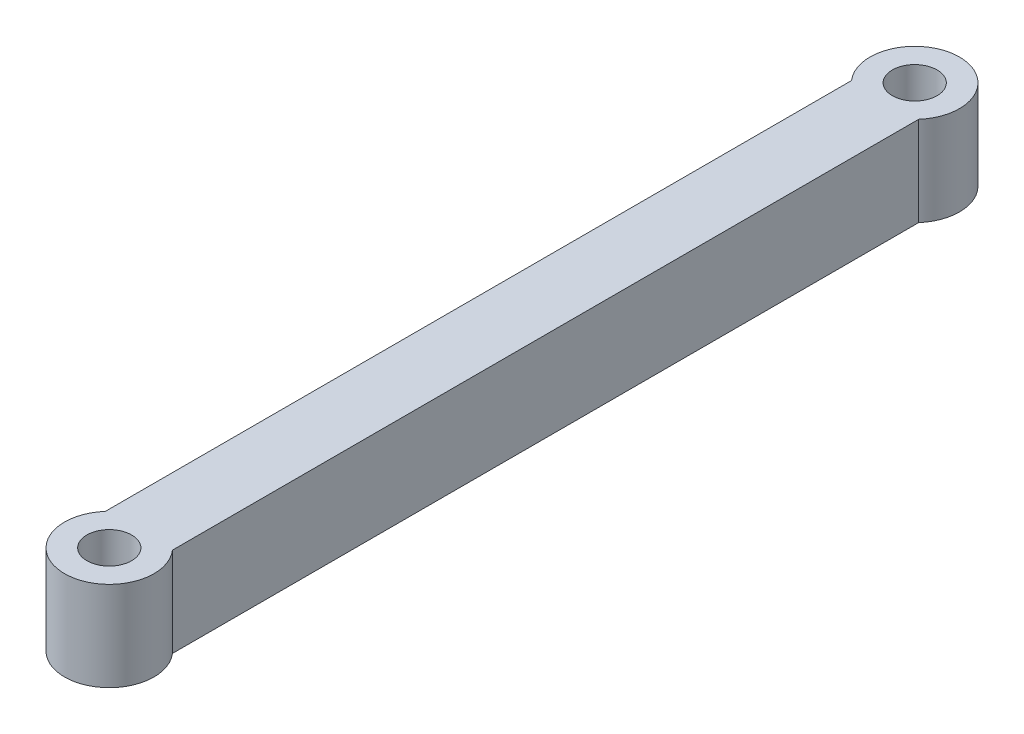
ISO-10303-21;
HEADER;
FILE_DESCRIPTION(('STEP AP214'),'2;1');
FILE_NAME('part.step','',(''),(''),'','','');
FILE_SCHEMA(('AUTOMOTIVE_DESIGN { 1 0 10303 214 1 1 1 1 }'));
ENDSEC;
DATA;
#1=APPLICATION_CONTEXT('core data for automotive mechanical design processes');
#2=APPLICATION_PROTOCOL_DEFINITION('international standard','automotive_design',2000,#1);
#3=PRODUCT_CONTEXT('',#1,'mechanical');
#4=PRODUCT('Part','Part','',(#3));
#5=PRODUCT_RELATED_PRODUCT_CATEGORY('part','',(#4));
#6=PRODUCT_DEFINITION_FORMATION('','',#4);
#7=PRODUCT_DEFINITION_CONTEXT('part definition',#1,'design');
#8=PRODUCT_DEFINITION('design','',#6,#7);
#9=PRODUCT_DEFINITION_SHAPE('','',#8);
#10=(LENGTH_UNIT() NAMED_UNIT(*) SI_UNIT(.MILLI.,.METRE.));
#11=(NAMED_UNIT(*) PLANE_ANGLE_UNIT() SI_UNIT($,.RADIAN.));
#12=(NAMED_UNIT(*) SI_UNIT($,.STERADIAN.) SOLID_ANGLE_UNIT());
#13=UNCERTAINTY_MEASURE_WITH_UNIT(LENGTH_MEASURE(1.E-05),#10,'distance_accuracy_value','');
#14=(GEOMETRIC_REPRESENTATION_CONTEXT(3) GLOBAL_UNCERTAINTY_ASSIGNED_CONTEXT((#13)) GLOBAL_UNIT_ASSIGNED_CONTEXT((#10,
#11,#12)) REPRESENTATION_CONTEXT('',''));
#15=CARTESIAN_POINT('',(0.,0.,0.));
#16=DIRECTION('',(0.,0.,1.));
#17=DIRECTION('',(1.,0.,0.));
#18=AXIS2_PLACEMENT_3D('',#15,#16,#17);
#19=CARTESIAN_POINT('',(0.,10.,45.));
#20=DIRECTION('',(0.,-1.,0.));
#21=DIRECTION('',(0.,0.,-1.));
#22=AXIS2_PLACEMENT_3D('',#19,#20,#21);
#23=PLANE('',#22);
#24=CARTESIAN_POINT('',(0.,10.,45.));
#25=DIRECTION('',(0.,1.,0.));
#26=DIRECTION('',(0.,0.,-1.));
#27=AXIS2_PLACEMENT_3D('',#24,#25,#26);
#28=CIRCLE('',#27,5.);
#29=CARTESIAN_POINT('',(-3.74999999999998,10.,41.6928108611692));
#30=VERTEX_POINT('',#29);
#31=CARTESIAN_POINT('',(3.75000000000001,10.,41.6928108611693));
#32=VERTEX_POINT('',#31);
#33=EDGE_CURVE('E88',#30,#32,#28,.T.);
#34=ORIENTED_EDGE('',*,*,#33,.T.);
#35=DIRECTION('',(0.,0.,-1.));
#36=VECTOR('',#35,1.);
#37=CARTESIAN_POINT('',(3.74999999999999,10.,-41.6928108611692));
#38=LINE('',#37,#36);
#39=CARTESIAN_POINT('',(3.74999999999999,10.,-41.6928108611692));
#40=VERTEX_POINT('',#39);
#41=EDGE_CURVE('E83',#32,#40,#38,.T.);
#42=ORIENTED_EDGE('',*,*,#41,.T.);
#43=CARTESIAN_POINT('',(0.,10.,-45.));
#44=DIRECTION('',(0.,1.,0.));
#45=DIRECTION('',(0.,0.,1.));
#46=AXIS2_PLACEMENT_3D('',#43,#44,#45);
#47=CIRCLE('',#46,5.);
#48=CARTESIAN_POINT('',(-3.74999999999999,10.,-41.6928108611692));
#49=VERTEX_POINT('',#48);
#50=EDGE_CURVE('E86',#40,#49,#47,.T.);
#51=ORIENTED_EDGE('',*,*,#50,.T.);
#52=DIRECTION('',(0.,0.,1.));
#53=VECTOR('',#52,1.);
#54=CARTESIAN_POINT('',(-3.74999999999999,10.,-41.6928108611692));
#55=LINE('',#54,#53);
#56=EDGE_CURVE('E53',#49,#30,#55,.T.);
#57=ORIENTED_EDGE('',*,*,#56,.T.);
#58=EDGE_LOOP('',(#34,#42,#51,#57));
#59=FACE_BOUND('',#58,.T.);
#60=CARTESIAN_POINT('',(0.,10.,-45.));
#61=DIRECTION('',(0.,1.,0.));
#62=DIRECTION('',(0.,0.,1.));
#63=AXIS2_PLACEMENT_3D('',#60,#61,#62);
#64=CIRCLE('',#63,2.5);
#65=CARTESIAN_POINT('',(0.,10.,-42.5));
#66=VERTEX_POINT('',#65);
#67=EDGE_CURVE('E103',#66,#66,#64,.T.);
#68=ORIENTED_EDGE('',*,*,#67,.F.);
#69=EDGE_LOOP('',(#68));
#70=FACE_BOUND('',#69,.T.);
#71=CARTESIAN_POINT('',(0.,10.,45.));
#72=DIRECTION('',(0.,1.,0.));
#73=DIRECTION('',(0.,0.,1.));
#74=AXIS2_PLACEMENT_3D('',#71,#72,#73);
#75=CIRCLE('',#74,2.5);
#76=CARTESIAN_POINT('',(0.,10.,47.5));
#77=VERTEX_POINT('',#76);
#78=EDGE_CURVE('E118',#77,#77,#75,.T.);
#79=ORIENTED_EDGE('',*,*,#78,.F.);
#80=EDGE_LOOP('',(#79));
#81=FACE_BOUND('',#80,.T.);
#82=ADVANCED_FACE('F36',(#59,#70,#81),#23,.F.);
#83=CARTESIAN_POINT('',(0.,0.,45.));
#84=DIRECTION('',(0.,-1.,0.));
#85=DIRECTION('',(0.,0.,-1.));
#86=AXIS2_PLACEMENT_3D('',#83,#84,#85);
#87=PLANE('',#86);
#88=CARTESIAN_POINT('',(0.,0.,-45.));
#89=DIRECTION('',(0.,1.,0.));
#90=DIRECTION('',(0.,0.,1.));
#91=AXIS2_PLACEMENT_3D('',#88,#89,#90);
#92=CIRCLE('',#91,2.5);
#93=CARTESIAN_POINT('',(0.,0.,-42.5));
#94=VERTEX_POINT('',#93);
#95=EDGE_CURVE('E115',#94,#94,#92,.T.);
#96=ORIENTED_EDGE('',*,*,#95,.T.);
#97=EDGE_LOOP('',(#96));
#98=FACE_BOUND('',#97,.T.);
#99=CARTESIAN_POINT('',(0.,0.,45.));
#100=DIRECTION('',(0.,1.,0.));
#101=DIRECTION('',(0.,0.,-1.));
#102=AXIS2_PLACEMENT_3D('',#99,#100,#101);
#103=CIRCLE('',#102,5.);
#104=CARTESIAN_POINT('',(-3.74999999999998,0.,41.6928108611692));
#105=VERTEX_POINT('',#104);
#106=CARTESIAN_POINT('',(3.75000000000001,0.,41.6928108611693));
#107=VERTEX_POINT('',#106);
#108=EDGE_CURVE('E100',#105,#107,#103,.T.);
#109=ORIENTED_EDGE('',*,*,#108,.F.);
#110=DIRECTION('',(0.,0.,1.));
#111=VECTOR('',#110,1.);
#112=CARTESIAN_POINT('',(-3.74999999999999,0.,-41.6928108611692));
#113=LINE('',#112,#111);
#114=CARTESIAN_POINT('',(-3.74999999999999,0.,-41.6928108611692));
#115=VERTEX_POINT('',#114);
#116=EDGE_CURVE('E76',#115,#105,#113,.T.);
#117=ORIENTED_EDGE('',*,*,#116,.F.);
#118=CARTESIAN_POINT('',(0.,0.,-45.));
#119=DIRECTION('',(0.,1.,0.));
#120=DIRECTION('',(0.,0.,1.));
#121=AXIS2_PLACEMENT_3D('',#118,#119,#120);
#122=CIRCLE('',#121,5.);
#123=CARTESIAN_POINT('',(3.74999999999999,0.,-41.6928108611692));
#124=VERTEX_POINT('',#123);
#125=EDGE_CURVE('E70',#124,#115,#122,.T.);
#126=ORIENTED_EDGE('',*,*,#125,.F.);
#127=DIRECTION('',(0.,0.,-1.));
#128=VECTOR('',#127,1.);
#129=CARTESIAN_POINT('',(3.74999999999999,0.,-41.6928108611692));
#130=LINE('',#129,#128);
#131=EDGE_CURVE('E92',#107,#124,#130,.T.);
#132=ORIENTED_EDGE('',*,*,#131,.F.);
#133=EDGE_LOOP('',(#109,#117,#126,#132));
#134=FACE_BOUND('',#133,.T.);
#135=CARTESIAN_POINT('',(0.,0.,45.));
#136=DIRECTION('',(0.,1.,0.));
#137=DIRECTION('',(0.,0.,1.));
#138=AXIS2_PLACEMENT_3D('',#135,#136,#137);
#139=CIRCLE('',#138,2.5);
#140=CARTESIAN_POINT('',(0.,0.,47.5));
#141=VERTEX_POINT('',#140);
#142=EDGE_CURVE('E121',#141,#141,#139,.T.);
#143=ORIENTED_EDGE('',*,*,#142,.T.);
#144=EDGE_LOOP('',(#143));
#145=FACE_BOUND('',#144,.T.);
#146=ADVANCED_FACE('F111',(#98,#134,#145),#87,.T.);
#147=CARTESIAN_POINT('',(0.,10.,45.));
#148=DIRECTION('',(0.,-1.,0.));
#149=DIRECTION('',(0.,0.,-1.));
#150=AXIS2_PLACEMENT_3D('',#147,#148,#149);
#151=CYLINDRICAL_SURFACE('',#150,5.);
#152=ORIENTED_EDGE('',*,*,#108,.T.);
#153=DIRECTION('',(0.,-1.,0.));
#154=VECTOR('',#153,1.);
#155=CARTESIAN_POINT('',(3.75000000000001,10.,41.6928108611693));
#156=LINE('',#155,#154);
#157=EDGE_CURVE('E11',#32,#107,#156,.T.);
#158=ORIENTED_EDGE('',*,*,#157,.F.);
#159=ORIENTED_EDGE('',*,*,#33,.F.);
#160=DIRECTION('',(0.,-1.,0.));
#161=VECTOR('',#160,1.);
#162=CARTESIAN_POINT('',(-3.74999999999998,10.,41.6928108611692));
#163=LINE('',#162,#161);
#164=EDGE_CURVE('E96',#30,#105,#163,.T.);
#165=ORIENTED_EDGE('',*,*,#164,.T.);
#166=EDGE_LOOP('',(#152,#158,#159,#165));
#167=FACE_BOUND('',#166,.T.);
#168=ADVANCED_FACE('F38',(#167),#151,.T.);
#169=CARTESIAN_POINT('',(3.74999999999999,10.,-41.6928108611692));
#170=DIRECTION('',(-1.,0.,0.));
#171=DIRECTION('',(0.,0.,1.));
#172=AXIS2_PLACEMENT_3D('',#169,#170,#171);
#173=PLANE('',#172);
#174=ORIENTED_EDGE('',*,*,#131,.T.);
#175=DIRECTION('',(0.,-1.,0.));
#176=VECTOR('',#175,1.);
#177=CARTESIAN_POINT('',(3.74999999999999,10.,-41.6928108611692));
#178=LINE('',#177,#176);
#179=EDGE_CURVE('E45',#40,#124,#178,.T.);
#180=ORIENTED_EDGE('',*,*,#179,.F.);
#181=ORIENTED_EDGE('',*,*,#41,.F.);
#182=ORIENTED_EDGE('',*,*,#157,.T.);
#183=EDGE_LOOP('',(#174,#180,#181,#182));
#184=FACE_BOUND('',#183,.T.);
#185=ADVANCED_FACE('F91',(#184),#173,.F.);
#186=CARTESIAN_POINT('',(0.,10.,-45.));
#187=DIRECTION('',(0.,-1.,0.));
#188=DIRECTION('',(0.,0.,-1.));
#189=AXIS2_PLACEMENT_3D('',#186,#187,#188);
#190=CYLINDRICAL_SURFACE('',#189,5.);
#191=ORIENTED_EDGE('',*,*,#125,.T.);
#192=DIRECTION('',(0.,-1.,0.));
#193=VECTOR('',#192,1.);
#194=CARTESIAN_POINT('',(-3.74999999999999,10.,-41.6928108611692));
#195=LINE('',#194,#193);
#196=EDGE_CURVE('E93',#49,#115,#195,.T.);
#197=ORIENTED_EDGE('',*,*,#196,.F.);
#198=ORIENTED_EDGE('',*,*,#50,.F.);
#199=ORIENTED_EDGE('',*,*,#179,.T.);
#200=EDGE_LOOP('',(#191,#197,#198,#199));
#201=FACE_BOUND('',#200,.T.);
#202=ADVANCED_FACE('F94',(#201),#190,.T.);
#203=CARTESIAN_POINT('',(-3.74999999999999,10.,-41.6928108611692));
#204=DIRECTION('',(1.,0.,0.));
#205=DIRECTION('',(0.,0.,-1.));
#206=AXIS2_PLACEMENT_3D('',#203,#204,#205);
#207=PLANE('',#206);
#208=ORIENTED_EDGE('',*,*,#116,.T.);
#209=ORIENTED_EDGE('',*,*,#164,.F.);
#210=ORIENTED_EDGE('',*,*,#56,.F.);
#211=ORIENTED_EDGE('',*,*,#196,.T.);
#212=EDGE_LOOP('',(#208,#209,#210,#211));
#213=FACE_BOUND('',#212,.T.);
#214=ADVANCED_FACE('F108',(#213),#207,.F.);
#215=CARTESIAN_POINT('',(0.,10.,-45.));
#216=DIRECTION('',(0.,-1.,0.));
#217=DIRECTION('',(0.,0.,-1.));
#218=AXIS2_PLACEMENT_3D('',#215,#216,#217);
#219=CYLINDRICAL_SURFACE('',#218,2.5);
#220=ORIENTED_EDGE('',*,*,#67,.T.);
#221=EDGE_LOOP('',(#220));
#222=FACE_BOUND('',#221,.T.);
#223=ORIENTED_EDGE('',*,*,#95,.F.);
#224=EDGE_LOOP('',(#223));
#225=FACE_BOUND('',#224,.T.);
#226=ADVANCED_FACE('F138',(#222,#225),#219,.F.);
#227=CARTESIAN_POINT('',(0.,10.,45.));
#228=DIRECTION('',(0.,-1.,0.));
#229=DIRECTION('',(0.,0.,-1.));
#230=AXIS2_PLACEMENT_3D('',#227,#228,#229);
#231=CYLINDRICAL_SURFACE('',#230,2.5);
#232=ORIENTED_EDGE('',*,*,#78,.T.);
#233=EDGE_LOOP('',(#232));
#234=FACE_BOUND('',#233,.T.);
#235=ORIENTED_EDGE('',*,*,#142,.F.);
#236=EDGE_LOOP('',(#235));
#237=FACE_BOUND('',#236,.T.);
#238=ADVANCED_FACE('F127',(#234,#237),#231,.F.);
#239=CLOSED_SHELL('',(#82,#146,#168,#185,#202,#214,#226,#238));
#240=MANIFOLD_SOLID_BREP('B2',#239);
#241=ADVANCED_BREP_SHAPE_REPRESENTATION('',(#18,#240),#14);
#242=SHAPE_DEFINITION_REPRESENTATION(#9,#241);
ENDSEC;
END-ISO-10303-21;
